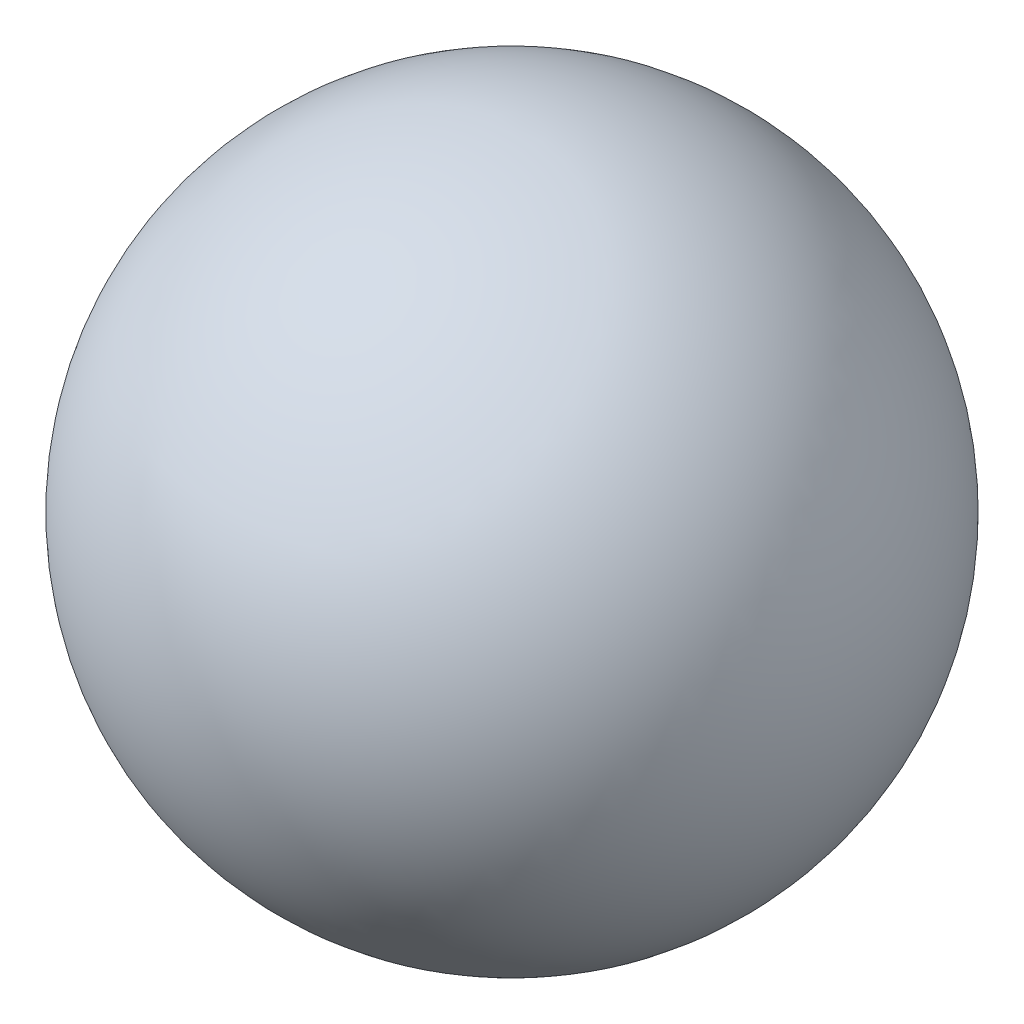
ISO-10303-21;
HEADER;
FILE_DESCRIPTION(('STEP AP214'),'2;1');
FILE_NAME('part.step','',(''),(''),'','','');
FILE_SCHEMA(('AUTOMOTIVE_DESIGN { 1 0 10303 214 1 1 1 1 }'));
ENDSEC;
DATA;
#1=APPLICATION_CONTEXT('core data for automotive mechanical design processes');
#2=APPLICATION_PROTOCOL_DEFINITION('international standard','automotive_design',2000,#1);
#3=PRODUCT_CONTEXT('',#1,'mechanical');
#4=PRODUCT('Part','Part','',(#3));
#5=PRODUCT_RELATED_PRODUCT_CATEGORY('part','',(#4));
#6=PRODUCT_DEFINITION_FORMATION('','',#4);
#7=PRODUCT_DEFINITION_CONTEXT('part definition',#1,'design');
#8=PRODUCT_DEFINITION('design','',#6,#7);
#9=PRODUCT_DEFINITION_SHAPE('','',#8);
#10=(LENGTH_UNIT() NAMED_UNIT(*) SI_UNIT(.MILLI.,.METRE.));
#11=(NAMED_UNIT(*) PLANE_ANGLE_UNIT() SI_UNIT($,.RADIAN.));
#12=(NAMED_UNIT(*) SI_UNIT($,.STERADIAN.) SOLID_ANGLE_UNIT());
#13=UNCERTAINTY_MEASURE_WITH_UNIT(LENGTH_MEASURE(1.E-05),#10,'distance_accuracy_value','');
#14=(GEOMETRIC_REPRESENTATION_CONTEXT(3) GLOBAL_UNCERTAINTY_ASSIGNED_CONTEXT((#13)) GLOBAL_UNIT_ASSIGNED_CONTEXT((#10,
#11,#12)) REPRESENTATION_CONTEXT('',''));
#15=CARTESIAN_POINT('',(0.,0.,0.));
#16=DIRECTION('',(0.,0.,1.));
#17=DIRECTION('',(1.,0.,0.));
#18=AXIS2_PLACEMENT_3D('',#15,#16,#17);
#19=CARTESIAN_POINT('',(0.,0.,0.));
#20=DIRECTION('',(0.,-1.,0.));
#21=DIRECTION('',(1.,0.,0.));
#22=AXIS2_PLACEMENT_3D('',#19,#20,#21);
#23=SPHERICAL_SURFACE('',#22,37.5);
#24=CARTESIAN_POINT('',(0.,-37.5,0.));
#25=VERTEX_POINT('',#24);
#26=VERTEX_LOOP('',#25);
#27=FACE_BOUND('',#26,.T.);
#28=ADVANCED_FACE('F39',(#27),#23,.T.);
#29=CLOSED_SHELL('',(#28));
#30=MANIFOLD_SOLID_BREP('B2',#29);
#31=ADVANCED_BREP_SHAPE_REPRESENTATION('',(#18,#30),#14);
#32=SHAPE_DEFINITION_REPRESENTATION(#9,#31);
ENDSEC;
END-ISO-10303-21;
